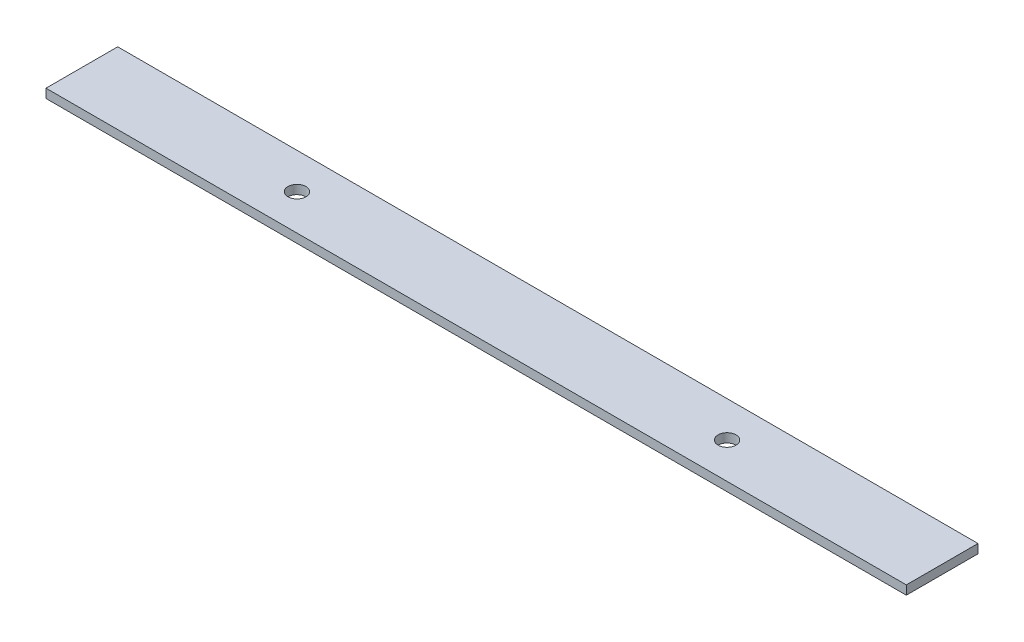
ISO-10303-21;
HEADER;
FILE_DESCRIPTION(('STEP AP214'),'2;1');
FILE_NAME('part.step','',(''),(''),'','','');
FILE_SCHEMA(('AUTOMOTIVE_DESIGN { 1 0 10303 214 1 1 1 1 }'));
ENDSEC;
DATA;
#1=APPLICATION_CONTEXT('core data for automotive mechanical design processes');
#2=APPLICATION_PROTOCOL_DEFINITION('international standard','automotive_design',2000,#1);
#3=PRODUCT_CONTEXT('',#1,'mechanical');
#4=PRODUCT('Part','Part','',(#3));
#5=PRODUCT_RELATED_PRODUCT_CATEGORY('part','',(#4));
#6=PRODUCT_DEFINITION_FORMATION('','',#4);
#7=PRODUCT_DEFINITION_CONTEXT('part definition',#1,'design');
#8=PRODUCT_DEFINITION('design','',#6,#7);
#9=PRODUCT_DEFINITION_SHAPE('','',#8);
#10=(LENGTH_UNIT() NAMED_UNIT(*) SI_UNIT(.MILLI.,.METRE.));
#11=(NAMED_UNIT(*) PLANE_ANGLE_UNIT() SI_UNIT($,.RADIAN.));
#12=(NAMED_UNIT(*) SI_UNIT($,.STERADIAN.) SOLID_ANGLE_UNIT());
#13=UNCERTAINTY_MEASURE_WITH_UNIT(LENGTH_MEASURE(1.E-05),#10,'distance_accuracy_value','');
#14=(GEOMETRIC_REPRESENTATION_CONTEXT(3) GLOBAL_UNCERTAINTY_ASSIGNED_CONTEXT((#13)) GLOBAL_UNIT_ASSIGNED_CONTEXT((#10,
#11,#12)) REPRESENTATION_CONTEXT('',''));
#15=CARTESIAN_POINT('',(0.,0.,0.));
#16=DIRECTION('',(0.,0.,1.));
#17=DIRECTION('',(1.,0.,0.));
#18=AXIS2_PLACEMENT_3D('',#15,#16,#17);
#19=CARTESIAN_POINT('',(0.,3.175,0.));
#20=DIRECTION('',(1.,0.,0.));
#21=DIRECTION('',(0.,0.,-1.));
#22=AXIS2_PLACEMENT_3D('',#19,#20,#21);
#23=PLANE('',#22);
#24=DIRECTION('',(0.,0.,1.));
#25=VECTOR('',#24,1.);
#26=CARTESIAN_POINT('',(0.,0.,0.));
#27=LINE('',#26,#25);
#28=CARTESIAN_POINT('',(0.,0.,0.));
#29=VERTEX_POINT('',#28);
#30=CARTESIAN_POINT('',(0.,0.,25.4));
#31=VERTEX_POINT('',#30);
#32=EDGE_CURVE('E96',#29,#31,#27,.T.);
#33=ORIENTED_EDGE('',*,*,#32,.T.);
#34=DIRECTION('',(0.,-1.,0.));
#35=VECTOR('',#34,1.);
#36=CARTESIAN_POINT('',(0.,3.175,25.4));
#37=LINE('',#36,#35);
#38=CARTESIAN_POINT('',(0.,3.175,25.4));
#39=VERTEX_POINT('',#38);
#40=EDGE_CURVE('E11',#39,#31,#37,.T.);
#41=ORIENTED_EDGE('',*,*,#40,.F.);
#42=DIRECTION('',(0.,0.,1.));
#43=VECTOR('',#42,1.);
#44=CARTESIAN_POINT('',(0.,3.175,0.));
#45=LINE('',#44,#43);
#46=CARTESIAN_POINT('',(0.,3.175,0.));
#47=VERTEX_POINT('',#46);
#48=EDGE_CURVE('E84',#47,#39,#45,.T.);
#49=ORIENTED_EDGE('',*,*,#48,.F.);
#50=DIRECTION('',(0.,-1.,0.));
#51=VECTOR('',#50,1.);
#52=CARTESIAN_POINT('',(0.,3.175,0.));
#53=LINE('',#52,#51);
#54=EDGE_CURVE('E92',#47,#29,#53,.T.);
#55=ORIENTED_EDGE('',*,*,#54,.T.);
#56=EDGE_LOOP('',(#33,#41,#49,#55));
#57=FACE_BOUND('',#56,.T.);
#58=ADVANCED_FACE('F33',(#57),#23,.F.);
#59=CARTESIAN_POINT('',(0.,3.175,25.4));
#60=DIRECTION('',(0.,0.,-1.));
#61=DIRECTION('',(-1.,0.,0.));
#62=AXIS2_PLACEMENT_3D('',#59,#60,#61);
#63=PLANE('',#62);
#64=DIRECTION('',(1.,0.,0.));
#65=VECTOR('',#64,1.);
#66=CARTESIAN_POINT('',(0.,0.,25.4));
#67=LINE('',#66,#65);
#68=CARTESIAN_POINT('',(304.8,0.,25.4));
#69=VERTEX_POINT('',#68);
#70=EDGE_CURVE('E88',#31,#69,#67,.T.);
#71=ORIENTED_EDGE('',*,*,#70,.T.);
#72=DIRECTION('',(0.,-1.,0.));
#73=VECTOR('',#72,1.);
#74=CARTESIAN_POINT('',(304.8,3.175,25.4));
#75=LINE('',#74,#73);
#76=CARTESIAN_POINT('',(304.8,3.175,25.4));
#77=VERTEX_POINT('',#76);
#78=EDGE_CURVE('E41',#77,#69,#75,.T.);
#79=ORIENTED_EDGE('',*,*,#78,.F.);
#80=DIRECTION('',(1.,0.,0.));
#81=VECTOR('',#80,1.);
#82=CARTESIAN_POINT('',(0.,3.175,25.4));
#83=LINE('',#82,#81);
#84=EDGE_CURVE('E79',#39,#77,#83,.T.);
#85=ORIENTED_EDGE('',*,*,#84,.F.);
#86=ORIENTED_EDGE('',*,*,#40,.T.);
#87=EDGE_LOOP('',(#71,#79,#85,#86));
#88=FACE_BOUND('',#87,.T.);
#89=ADVANCED_FACE('F87',(#88),#63,.F.);
#90=CARTESIAN_POINT('',(304.8,3.175,0.));
#91=DIRECTION('',(-1.,0.,0.));
#92=DIRECTION('',(0.,0.,1.));
#93=AXIS2_PLACEMENT_3D('',#90,#91,#92);
#94=PLANE('',#93);
#95=DIRECTION('',(0.,0.,-1.));
#96=VECTOR('',#95,1.);
#97=CARTESIAN_POINT('',(304.8,0.,0.));
#98=LINE('',#97,#96);
#99=CARTESIAN_POINT('',(304.8,0.,0.));
#100=VERTEX_POINT('',#99);
#101=EDGE_CURVE('E66',#69,#100,#98,.T.);
#102=ORIENTED_EDGE('',*,*,#101,.T.);
#103=DIRECTION('',(0.,-1.,0.));
#104=VECTOR('',#103,1.);
#105=CARTESIAN_POINT('',(304.8,3.175,0.));
#106=LINE('',#105,#104);
#107=CARTESIAN_POINT('',(304.8,3.175,0.));
#108=VERTEX_POINT('',#107);
#109=EDGE_CURVE('E89',#108,#100,#106,.T.);
#110=ORIENTED_EDGE('',*,*,#109,.F.);
#111=DIRECTION('',(0.,0.,-1.));
#112=VECTOR('',#111,1.);
#113=CARTESIAN_POINT('',(304.8,3.175,0.));
#114=LINE('',#113,#112);
#115=EDGE_CURVE('E82',#77,#108,#114,.T.);
#116=ORIENTED_EDGE('',*,*,#115,.F.);
#117=ORIENTED_EDGE('',*,*,#78,.T.);
#118=EDGE_LOOP('',(#102,#110,#116,#117));
#119=FACE_BOUND('',#118,.T.);
#120=ADVANCED_FACE('F90',(#119),#94,.F.);
#121=CARTESIAN_POINT('',(0.,3.175,0.));
#122=DIRECTION('',(0.,0.,1.));
#123=DIRECTION('',(1.,0.,0.));
#124=AXIS2_PLACEMENT_3D('',#121,#122,#123);
#125=PLANE('',#124);
#126=DIRECTION('',(-1.,0.,0.));
#127=VECTOR('',#126,1.);
#128=CARTESIAN_POINT('',(0.,0.,0.));
#129=LINE('',#128,#127);
#130=EDGE_CURVE('E72',#100,#29,#129,.T.);
#131=ORIENTED_EDGE('',*,*,#130,.T.);
#132=ORIENTED_EDGE('',*,*,#54,.F.);
#133=DIRECTION('',(-1.,0.,0.));
#134=VECTOR('',#133,1.);
#135=CARTESIAN_POINT('',(0.,3.175,0.));
#136=LINE('',#135,#134);
#137=EDGE_CURVE('E49',#108,#47,#136,.T.);
#138=ORIENTED_EDGE('',*,*,#137,.F.);
#139=ORIENTED_EDGE('',*,*,#109,.T.);
#140=EDGE_LOOP('',(#131,#132,#138,#139));
#141=FACE_BOUND('',#140,.T.);
#142=ADVANCED_FACE('F104',(#141),#125,.F.);
#143=CARTESIAN_POINT('',(0.,3.175,0.));
#144=DIRECTION('',(0.,1.,0.));
#145=DIRECTION('',(0.,0.,1.));
#146=AXIS2_PLACEMENT_3D('',#143,#144,#145);
#147=PLANE('',#146);
#148=CARTESIAN_POINT('',(228.6,3.175,12.7000000000007));
#149=DIRECTION('',(0.,1.,0.));
#150=DIRECTION('',(0.,0.,-1.));
#151=AXIS2_PLACEMENT_3D('',#148,#149,#150);
#152=CIRCLE('',#151,3.17500000000001);
#153=CARTESIAN_POINT('',(228.6,3.175,9.5250000000007));
#154=VERTEX_POINT('',#153);
#155=EDGE_CURVE('E118',#154,#154,#152,.T.);
#156=ORIENTED_EDGE('',*,*,#155,.F.);
#157=EDGE_LOOP('',(#156));
#158=FACE_BOUND('',#157,.T.);
#159=CARTESIAN_POINT('',(76.2,3.175,12.7));
#160=DIRECTION('',(0.,1.,0.));
#161=DIRECTION('',(0.,0.,1.));
#162=AXIS2_PLACEMENT_3D('',#159,#160,#161);
#163=CIRCLE('',#162,3.175);
#164=CARTESIAN_POINT('',(76.2,3.175,15.875));
#165=VERTEX_POINT('',#164);
#166=EDGE_CURVE('E112',#165,#165,#163,.T.);
#167=ORIENTED_EDGE('',*,*,#166,.F.);
#168=EDGE_LOOP('',(#167));
#169=FACE_BOUND('',#168,.T.);
#170=ORIENTED_EDGE('',*,*,#48,.T.);
#171=ORIENTED_EDGE('',*,*,#84,.T.);
#172=ORIENTED_EDGE('',*,*,#115,.T.);
#173=ORIENTED_EDGE('',*,*,#137,.T.);
#174=EDGE_LOOP('',(#170,#171,#172,#173));
#175=FACE_BOUND('',#174,.T.);
#176=ADVANCED_FACE('F80',(#158,#169,#175),#147,.T.);
#177=CARTESIAN_POINT('',(0.,0.,0.));
#178=DIRECTION('',(0.,1.,0.));
#179=DIRECTION('',(0.,0.,1.));
#180=AXIS2_PLACEMENT_3D('',#177,#178,#179);
#181=PLANE('',#180);
#182=CARTESIAN_POINT('',(228.6,0.,12.7000000000007));
#183=DIRECTION('',(0.,1.,0.));
#184=DIRECTION('',(0.,0.,1.));
#185=AXIS2_PLACEMENT_3D('',#182,#183,#184);
#186=CIRCLE('',#185,3.17500000000001);
#187=CARTESIAN_POINT('',(228.6,0.,15.8750000000007));
#188=VERTEX_POINT('',#187);
#189=EDGE_CURVE('E115',#188,#188,#186,.F.);
#190=ORIENTED_EDGE('',*,*,#189,.F.);
#191=EDGE_LOOP('',(#190));
#192=FACE_BOUND('',#191,.T.);
#193=CARTESIAN_POINT('',(76.2,0.,12.7));
#194=DIRECTION('',(0.,1.,0.));
#195=DIRECTION('',(0.,0.,1.));
#196=AXIS2_PLACEMENT_3D('',#193,#194,#195);
#197=CIRCLE('',#196,3.175);
#198=CARTESIAN_POINT('',(76.2,0.,15.875));
#199=VERTEX_POINT('',#198);
#200=EDGE_CURVE('E99',#199,#199,#197,.F.);
#201=ORIENTED_EDGE('',*,*,#200,.F.);
#202=EDGE_LOOP('',(#201));
#203=FACE_BOUND('',#202,.T.);
#204=ORIENTED_EDGE('',*,*,#32,.F.);
#205=ORIENTED_EDGE('',*,*,#130,.F.);
#206=ORIENTED_EDGE('',*,*,#101,.F.);
#207=ORIENTED_EDGE('',*,*,#70,.F.);
#208=EDGE_LOOP('',(#204,#205,#206,#207));
#209=FACE_BOUND('',#208,.T.);
#210=ADVANCED_FACE('F107',(#192,#203,#209),#181,.F.);
#211=CARTESIAN_POINT('',(76.2,-8.98025612106918,12.7));
#212=DIRECTION('',(0.,1.,0.));
#213=DIRECTION('',(0.,0.,1.));
#214=AXIS2_PLACEMENT_3D('',#211,#212,#213);
#215=CYLINDRICAL_SURFACE('',#214,3.175);
#216=ORIENTED_EDGE('',*,*,#200,.T.);
#217=EDGE_LOOP('',(#216));
#218=FACE_BOUND('',#217,.T.);
#219=ORIENTED_EDGE('',*,*,#166,.T.);
#220=EDGE_LOOP('',(#219));
#221=FACE_BOUND('',#220,.T.);
#222=ADVANCED_FACE('F129',(#218,#221),#215,.F.);
#223=CARTESIAN_POINT('',(228.6,-8.98025612106918,12.7000000000007));
#224=DIRECTION('',(0.,1.,0.));
#225=DIRECTION('',(0.,0.,1.));
#226=AXIS2_PLACEMENT_3D('',#223,#224,#225);
#227=CYLINDRICAL_SURFACE('',#226,3.17500000000001);
#228=ORIENTED_EDGE('',*,*,#189,.T.);
#229=EDGE_LOOP('',(#228));
#230=FACE_BOUND('',#229,.T.);
#231=ORIENTED_EDGE('',*,*,#155,.T.);
#232=EDGE_LOOP('',(#231));
#233=FACE_BOUND('',#232,.T.);
#234=ADVANCED_FACE('F122',(#230,#233),#227,.F.);
#235=CLOSED_SHELL('',(#58,#89,#120,#142,#176,#210,#222,#234));
#236=MANIFOLD_SOLID_BREP('B2',#235);
#237=ADVANCED_BREP_SHAPE_REPRESENTATION('',(#18,#236),#14);
#238=SHAPE_DEFINITION_REPRESENTATION(#9,#237);
ENDSEC;
END-ISO-10303-21;
